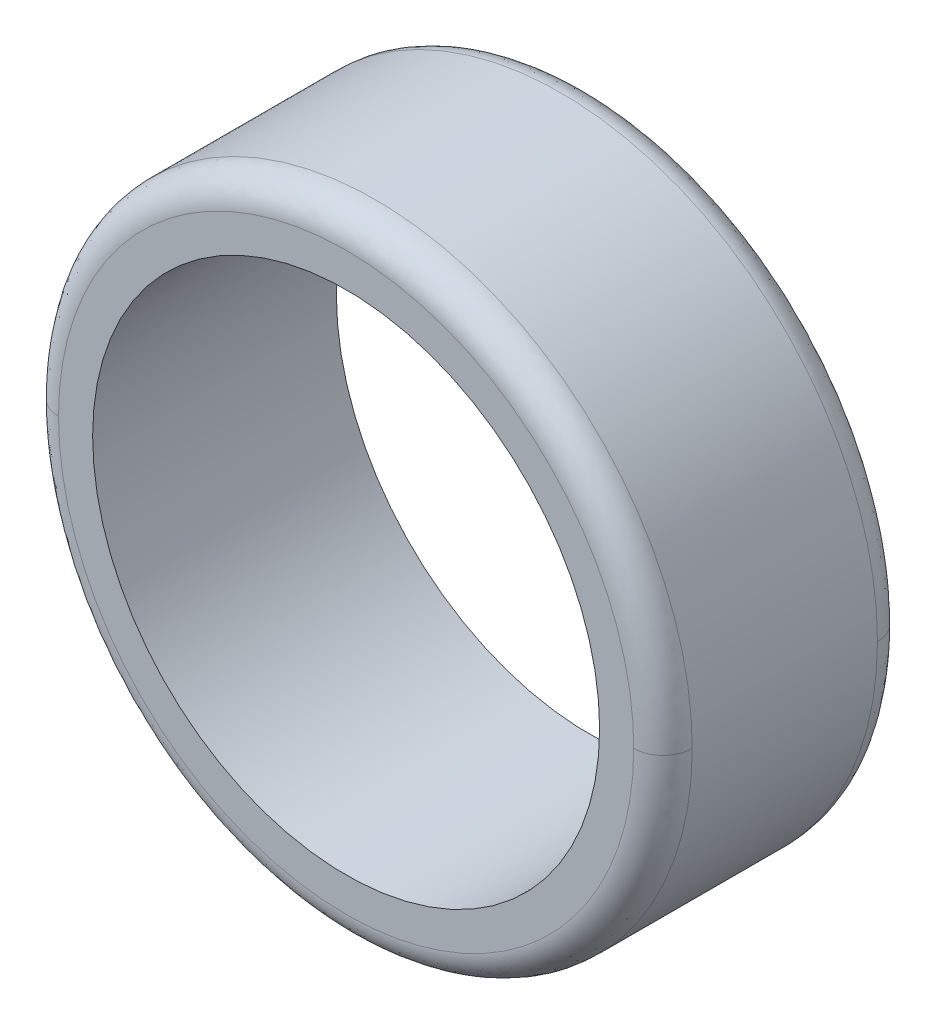
ISO-10303-21;
HEADER;
FILE_DESCRIPTION(('STEP AP214'),'2;1');
FILE_NAME('part.step','',(''),(''),'','','');
FILE_SCHEMA(('AUTOMOTIVE_DESIGN { 1 0 10303 214 1 1 1 1 }'));
ENDSEC;
DATA;
#1=APPLICATION_CONTEXT('core data for automotive mechanical design processes');
#2=APPLICATION_PROTOCOL_DEFINITION('international standard','automotive_design',2000,#1);
#3=PRODUCT_CONTEXT('',#1,'mechanical');
#4=PRODUCT('Part','Part','',(#3));
#5=PRODUCT_RELATED_PRODUCT_CATEGORY('part','',(#4));
#6=PRODUCT_DEFINITION_FORMATION('','',#4);
#7=PRODUCT_DEFINITION_CONTEXT('part definition',#1,'design');
#8=PRODUCT_DEFINITION('design','',#6,#7);
#9=PRODUCT_DEFINITION_SHAPE('','',#8);
#10=(LENGTH_UNIT() NAMED_UNIT(*) SI_UNIT(.MILLI.,.METRE.));
#11=(NAMED_UNIT(*) PLANE_ANGLE_UNIT() SI_UNIT($,.RADIAN.));
#12=(NAMED_UNIT(*) SI_UNIT($,.STERADIAN.) SOLID_ANGLE_UNIT());
#13=UNCERTAINTY_MEASURE_WITH_UNIT(LENGTH_MEASURE(1.E-05),#10,'distance_accuracy_value','');
#14=(GEOMETRIC_REPRESENTATION_CONTEXT(3) GLOBAL_UNCERTAINTY_ASSIGNED_CONTEXT((#13)) GLOBAL_UNIT_ASSIGNED_CONTEXT((#10,
#11,#12)) REPRESENTATION_CONTEXT('',''));
#15=CARTESIAN_POINT('',(0.,0.,0.));
#16=DIRECTION('',(0.,0.,1.));
#17=DIRECTION('',(1.,0.,0.));
#18=AXIS2_PLACEMENT_3D('',#15,#16,#17);
#19=CARTESIAN_POINT('',(-29.854,-29.854,-12.5));
#20=DIRECTION('',(0.,0.,1.));
#21=DIRECTION('',(1.,0.,0.));
#22=AXIS2_PLACEMENT_3D('',#19,#20,#21);
#23=PLANE('',#22);
#24=CARTESIAN_POINT('',(0.,0.,-12.5));
#25=DIRECTION('',(0.,0.,-1.));
#26=DIRECTION('',(-1.,0.,0.));
#27=AXIS2_PLACEMENT_3D('',#24,#25,#26);
#28=CIRCLE('',#27,26.);
#29=CARTESIAN_POINT('',(-26.,0.,-12.5));
#30=VERTEX_POINT('',#29);
#31=EDGE_CURVE('E21',#30,#30,#28,.T.);
#32=ORIENTED_EDGE('',*,*,#31,.F.);
#33=EDGE_LOOP('',(#32));
#34=FACE_BOUND('',#33,.T.);
#35=CARTESIAN_POINT('',(29.500000001415,0.,-12.5000000001223));
#36=CARTESIAN_POINT('',(29.500000001415,59.0000000026987,-12.5000000001223));
#37=CARTESIAN_POINT('',(-29.500000001415,59.0000000026987,-12.5000000001223));
#38=CARTESIAN_POINT('',(-29.500000001415,0.,-12.5000000001223));
#39=(BOUNDED_CURVE() B_SPLINE_CURVE(3,(#35,#36,#37,#38),.UNSPECIFIED.,.F.,
.F.) B_SPLINE_CURVE_WITH_KNOTS((4,4),(0.,1.),
.UNSPECIFIED.) CURVE() GEOMETRIC_REPRESENTATION_ITEM() RATIONAL_B_SPLINE_CURVE((0.956578302161616,
0.318859434053872,0.318859434053872,0.956578302161616)) REPRESENTATION_ITEM(''));
#40=CARTESIAN_POINT('',(29.4999999949896,0.,-12.5000000000734));
#41=VERTEX_POINT('',#40);
#42=CARTESIAN_POINT('',(-29.4999999949896,0.,-12.5000000000734));
#43=VERTEX_POINT('',#42);
#44=EDGE_CURVE('E56',#41,#43,#39,.T.);
#45=ORIENTED_EDGE('',*,*,#44,.F.);
#46=CARTESIAN_POINT('',(-29.500000001415,0.,-12.5000000001223));
#47=CARTESIAN_POINT('',(-29.500000001415,-59.0000000026987,-12.5000000001223));
#48=CARTESIAN_POINT('',(29.500000001415,-59.0000000026987,-12.5000000001223));
#49=CARTESIAN_POINT('',(29.500000001415,0.,-12.5000000001223));
#50=(BOUNDED_CURVE() B_SPLINE_CURVE(3,(#46,#47,#48,#49),.UNSPECIFIED.,.F.,
.F.) B_SPLINE_CURVE_WITH_KNOTS((4,4),(0.,1.),
.UNSPECIFIED.) CURVE() GEOMETRIC_REPRESENTATION_ITEM() RATIONAL_B_SPLINE_CURVE((0.956578302161616,
0.318859434053872,0.318859434053872,0.956578302161616)) REPRESENTATION_ITEM(''));
#51=EDGE_CURVE('E59',#43,#41,#50,.T.);
#52=ORIENTED_EDGE('',*,*,#51,.F.);
#53=EDGE_LOOP('',(#45,#52));
#54=FACE_BOUND('',#53,.T.);
#55=ADVANCED_FACE('F16',(#34,#54),#23,.F.);
#56=CARTESIAN_POINT('',(-32.485012496,0.,-9.20049975));
#57=CARTESIAN_POINT('',(-32.485012496,-64.970024992,-9.20049975));
#58=CARTESIAN_POINT('',(32.485012496,-64.970024992,-9.20049975));
#59=CARTESIAN_POINT('',(32.485012496,0.,-9.20049975));
#60=CARTESIAN_POINT('',(-32.689661268,0.,-11.240161296));
#61=CARTESIAN_POINT('',(-32.689661268,-65.379322536,-11.240161296));
#62=CARTESIAN_POINT('',(32.689661268,-65.379322536,-11.240161296));
#63=CARTESIAN_POINT('',(32.689661268,0.,-11.240161296));
#64=CARTESIAN_POINT('',(-31.240161296,0.,-12.689661268));
#65=CARTESIAN_POINT('',(-31.240161296,-62.480322591,-12.689661268));
#66=CARTESIAN_POINT('',(31.240161296,-62.480322591,-12.689661268));
#67=CARTESIAN_POINT('',(31.240161296,0.,-12.689661268));
#68=CARTESIAN_POINT('',(-29.20049975,0.,-12.485012496));
#69=CARTESIAN_POINT('',(-29.20049975,-58.4009995,-12.485012496));
#70=CARTESIAN_POINT('',(29.20049975,-58.4009995,-12.485012496));
#71=CARTESIAN_POINT('',(29.20049975,0.,-12.485012496));
#72=(BOUNDED_SURFACE() B_SPLINE_SURFACE(3,3,((#56,#57,#58,#59),(#60,#61,#62,#63),(#64,#65,#66,
#67),(#68,#69,#70,#71)),.UNSPECIFIED.,.F.,.F.,.F.) B_SPLINE_SURFACE_WITH_KNOTS((4,4),(4,4),(0.,
1.),(0.,1.),.UNSPECIFIED.) GEOMETRIC_REPRESENTATION_ITEM() RATIONAL_B_SPLINE_SURFACE(((1.,
0.333333333333333,0.333333333333333,1.),(0.755320871117972,0.251773623705991,0.251773623705991,
0.755320871117972),(0.755320871117972,0.251773623705991,0.251773623705991,0.755320871117972),
(1.,0.333333333333333,0.333333333333333,1.))) REPRESENTATION_ITEM('') SURFACE());
#73=CARTESIAN_POINT('',(32.485012496,0.,-9.20049975));
#74=CARTESIAN_POINT('',(32.689661268,0.,-11.240161296));
#75=CARTESIAN_POINT('',(31.240161296,0.,-12.689661268));
#76=CARTESIAN_POINT('',(29.20049975,0.,-12.485012496));
#77=(BOUNDED_CURVE() B_SPLINE_CURVE(3,(#73,#74,#75,#76),.UNSPECIFIED.,.F.,
.F.) B_SPLINE_CURVE_WITH_KNOTS((4,4),(0.,1.),
.UNSPECIFIED.) CURVE() GEOMETRIC_REPRESENTATION_ITEM() RATIONAL_B_SPLINE_CURVE((1.,
0.755320871117972,0.755320871117972,1.)) REPRESENTATION_ITEM(''));
#78=CARTESIAN_POINT('',(32.5000000000306,-9.99879214012239E-09,-9.50000000034546));
#79=VERTEX_POINT('',#78);
#80=EDGE_CURVE('E75',#79,#41,#77,.T.);
#81=CARTESIAN_POINT('',(0.,0.,-9.5));
#82=DIRECTION('',(0.,0.,-1.));
#83=DIRECTION('',(-1.,0.,0.));
#84=AXIS2_PLACEMENT_3D('',#81,#82,#83);
#85=CIRCLE('',#84,32.5);
#86=CARTESIAN_POINT('',(-32.5000000000306,-1.45914646196691E-09,-9.5));
#87=VERTEX_POINT('',#86);
#88=EDGE_CURVE('E71',#79,#87,#85,.T.);
#89=CARTESIAN_POINT('',(-32.485012496,0.,-9.20049975));
#90=CARTESIAN_POINT('',(-32.689661268,0.,-11.240161296));
#91=CARTESIAN_POINT('',(-31.240161296,0.,-12.689661268));
#92=CARTESIAN_POINT('',(-29.20049975,0.,-12.485012496));
#93=(BOUNDED_CURVE() B_SPLINE_CURVE(3,(#89,#90,#91,#92),.UNSPECIFIED.,.F.,
.F.) B_SPLINE_CURVE_WITH_KNOTS((4,4),(0.,1.),
.UNSPECIFIED.) CURVE() GEOMETRIC_REPRESENTATION_ITEM() RATIONAL_B_SPLINE_CURVE((1.,
0.755320871117972,0.755320871117972,1.)) REPRESENTATION_ITEM(''));
#94=EDGE_CURVE('E68',#43,#87,#93,.F.);
#95=ORIENTED_EDGE('',*,*,#80,.F.);
#96=ORIENTED_EDGE('',*,*,#88,.T.);
#97=ORIENTED_EDGE('',*,*,#94,.F.);
#98=ORIENTED_EDGE('',*,*,#51,.T.);
#99=EDGE_LOOP('',(#95,#96,#97,#98));
#100=FACE_BOUND('',#99,.T.);
#101=ADVANCED_FACE('F69',(#100),#72,.T.);
#102=CARTESIAN_POINT('',(32.485012496,0.,-9.20049975));
#103=CARTESIAN_POINT('',(32.485012496,64.970024992,-9.20049975));
#104=CARTESIAN_POINT('',(-32.485012496,64.970024992,-9.20049975));
#105=CARTESIAN_POINT('',(-32.485012496,0.,-9.20049975));
#106=CARTESIAN_POINT('',(32.689661268,0.,-11.240161296));
#107=CARTESIAN_POINT('',(32.689661268,65.379322536,-11.240161296));
#108=CARTESIAN_POINT('',(-32.689661268,65.379322536,-11.240161296));
#109=CARTESIAN_POINT('',(-32.689661268,0.,-11.240161296));
#110=CARTESIAN_POINT('',(31.240161296,0.,-12.689661268));
#111=CARTESIAN_POINT('',(31.240161296,62.480322591,-12.689661268));
#112=CARTESIAN_POINT('',(-31.240161296,62.480322591,-12.689661268));
#113=CARTESIAN_POINT('',(-31.240161296,0.,-12.689661268));
#114=CARTESIAN_POINT('',(29.20049975,0.,-12.485012496));
#115=CARTESIAN_POINT('',(29.20049975,58.4009995,-12.485012496));
#116=CARTESIAN_POINT('',(-29.20049975,58.4009995,-12.485012496));
#117=CARTESIAN_POINT('',(-29.20049975,0.,-12.485012496));
#118=(BOUNDED_SURFACE() B_SPLINE_SURFACE(3,3,((#102,#103,#104,#105),(#106,#107,#108,#109),(#110,
#111,#112,#113),(#114,#115,#116,#117)),.UNSPECIFIED.,.F.,.F.,
.F.) B_SPLINE_SURFACE_WITH_KNOTS((4,4),(4,4),(0.,1.),(0.,1.),
.UNSPECIFIED.) GEOMETRIC_REPRESENTATION_ITEM() RATIONAL_B_SPLINE_SURFACE(((1.,0.333333333333333,
0.333333333333333,1.),(0.755320871117972,0.251773623705991,0.251773623705991,0.755320871117972),
(0.755320871117972,0.251773623705991,0.251773623705991,0.755320871117972),(1.,0.333333333333333,
0.333333333333333,1.))) REPRESENTATION_ITEM('') SURFACE());
#119=CARTESIAN_POINT('',(0.,0.,-9.5));
#120=DIRECTION('',(0.,0.,-1.));
#121=DIRECTION('',(-1.,0.,0.));
#122=AXIS2_PLACEMENT_3D('',#119,#120,#121);
#123=CIRCLE('',#122,32.5);
#124=EDGE_CURVE('E162',#87,#79,#123,.T.);
#125=ORIENTED_EDGE('',*,*,#124,.T.);
#126=ORIENTED_EDGE('',*,*,#80,.T.);
#127=ORIENTED_EDGE('',*,*,#44,.T.);
#128=ORIENTED_EDGE('',*,*,#94,.T.);
#129=EDGE_LOOP('',(#125,#126,#127,#128));
#130=FACE_BOUND('',#129,.T.);
#131=ADVANCED_FACE('F78',(#130),#118,.T.);
#132=CARTESIAN_POINT('',(0.,0.,12.5));
#133=DIRECTION('',(0.,0.,-1.));
#134=DIRECTION('',(-1.,0.,0.));
#135=AXIS2_PLACEMENT_3D('',#132,#133,#134);
#136=CYLINDRICAL_SURFACE('',#135,26.);
#137=CARTESIAN_POINT('',(0.,0.,12.5));
#138=DIRECTION('',(0.,0.,-1.));
#139=DIRECTION('',(-1.,0.,0.));
#140=AXIS2_PLACEMENT_3D('',#137,#138,#139);
#141=CIRCLE('',#140,26.);
#142=CARTESIAN_POINT('',(-26.,0.,12.5));
#143=VERTEX_POINT('',#142);
#144=EDGE_CURVE('E154',#143,#143,#141,.T.);
#145=ORIENTED_EDGE('',*,*,#144,.F.);
#146=EDGE_LOOP('',(#145));
#147=FACE_BOUND('',#146,.T.);
#148=ORIENTED_EDGE('',*,*,#31,.T.);
#149=EDGE_LOOP('',(#148));
#150=FACE_BOUND('',#149,.T.);
#151=ADVANCED_FACE('F99',(#147,#150),#136,.F.);
#152=CARTESIAN_POINT('',(0.,0.,9.5));
#153=DIRECTION('',(0.,0.,-1.));
#154=DIRECTION('',(-1.,0.,0.));
#155=AXIS2_PLACEMENT_3D('',#152,#153,#154);
#156=CYLINDRICAL_SURFACE('',#155,32.5);
#157=ORIENTED_EDGE('',*,*,#124,.F.);
#158=ORIENTED_EDGE('',*,*,#88,.F.);
#159=EDGE_LOOP('',(#157,#158));
#160=FACE_BOUND('',#159,.T.);
#161=CARTESIAN_POINT('',(0.,0.,9.50000000138184));
#162=DIRECTION('',(0.,0.,1.));
#163=DIRECTION('',(1.,0.,0.));
#164=AXIS2_PLACEMENT_3D('',#161,#162,#163);
#165=CIRCLE('',#164,32.5000000001223);
#166=CARTESIAN_POINT('',(32.5000000000917,-3.33293071337413E-09,9.50000000138184));
#167=VERTEX_POINT('',#166);
#168=CARTESIAN_POINT('',(-32.5000000000917,0.,9.50000000103638));
#169=VERTEX_POINT('',#168);
#170=EDGE_CURVE('E225',#167,#169,#165,.T.);
#171=ORIENTED_EDGE('',*,*,#170,.F.);
#172=CARTESIAN_POINT('',(0.,0.,9.50000000138184));
#173=DIRECTION('',(0.,0.,1.));
#174=DIRECTION('',(1.,0.,0.));
#175=AXIS2_PLACEMENT_3D('',#172,#173,#174);
#176=CIRCLE('',#175,32.5000000001223);
#177=EDGE_CURVE('E161',#169,#167,#176,.T.);
#178=ORIENTED_EDGE('',*,*,#177,.F.);
#179=EDGE_LOOP('',(#171,#178));
#180=FACE_BOUND('',#179,.T.);
#181=ADVANCED_FACE('F185',(#160,#180),#156,.T.);
#182=CARTESIAN_POINT('',(-29.854,-29.854,12.5));
#183=DIRECTION('',(0.,0.,1.));
#184=DIRECTION('',(1.,0.,0.));
#185=AXIS2_PLACEMENT_3D('',#182,#183,#184);
#186=PLANE('',#185);
#187=ORIENTED_EDGE('',*,*,#144,.T.);
#188=EDGE_LOOP('',(#187));
#189=FACE_BOUND('',#188,.T.);
#190=CARTESIAN_POINT('',(-29.500000001415,0.,12.5000000001223));
#191=CARTESIAN_POINT('',(-29.500000001415,59.0000000026987,12.5000000001223));
#192=CARTESIAN_POINT('',(29.500000001415,59.0000000026987,12.5000000001223));
#193=CARTESIAN_POINT('',(29.500000001415,0.,12.5000000001223));
#194=(BOUNDED_CURVE() B_SPLINE_CURVE(3,(#190,#191,#192,#193),.UNSPECIFIED.,.F.,
.F.) B_SPLINE_CURVE_WITH_KNOTS((4,4),(0.,1.),
.UNSPECIFIED.) CURVE() GEOMETRIC_REPRESENTATION_ITEM() RATIONAL_B_SPLINE_CURVE((0.956578302161616,
0.318859434053872,0.318859434053872,0.956578302161616)) REPRESENTATION_ITEM(''));
#195=CARTESIAN_POINT('',(-29.4999999949896,0.,12.5000000000734));
#196=VERTEX_POINT('',#195);
#197=CARTESIAN_POINT('',(29.4999999949896,0.,12.5000000000734));
#198=VERTEX_POINT('',#197);
#199=EDGE_CURVE('E27',#196,#198,#194,.T.);
#200=ORIENTED_EDGE('',*,*,#199,.F.);
#201=CARTESIAN_POINT('',(29.500000001415,0.,12.5000000001223));
#202=CARTESIAN_POINT('',(29.500000001415,-59.0000000026987,12.5000000001223));
#203=CARTESIAN_POINT('',(-29.500000001415,-59.0000000026987,12.5000000001223));
#204=CARTESIAN_POINT('',(-29.500000001415,0.,12.5000000001223));
#205=(BOUNDED_CURVE() B_SPLINE_CURVE(3,(#201,#202,#203,#204),.UNSPECIFIED.,.F.,
.F.) B_SPLINE_CURVE_WITH_KNOTS((4,4),(0.,1.),
.UNSPECIFIED.) CURVE() GEOMETRIC_REPRESENTATION_ITEM() RATIONAL_B_SPLINE_CURVE((0.956578302161617,
0.318859434053872,0.318859434053872,0.956578302161617)) REPRESENTATION_ITEM(''));
#206=EDGE_CURVE('E35',#198,#196,#205,.T.);
#207=ORIENTED_EDGE('',*,*,#206,.F.);
#208=EDGE_LOOP('',(#200,#207));
#209=FACE_BOUND('',#208,.T.);
#210=ADVANCED_FACE('F18',(#189,#209),#186,.T.);
#211=CARTESIAN_POINT('',(-29.20049975,0.,12.485012496));
#212=CARTESIAN_POINT('',(-29.20049975,-58.4009995,12.485012496));
#213=CARTESIAN_POINT('',(29.20049975,-58.4009995,12.485012496));
#214=CARTESIAN_POINT('',(29.20049975,0.,12.485012496));
#215=CARTESIAN_POINT('',(-31.240161296,0.,12.689661268));
#216=CARTESIAN_POINT('',(-31.240161296,-62.480322591,12.689661268));
#217=CARTESIAN_POINT('',(31.240161296,-62.480322591,12.689661268));
#218=CARTESIAN_POINT('',(31.240161296,0.,12.689661268));
#219=CARTESIAN_POINT('',(-32.689661268,0.,11.240161296));
#220=CARTESIAN_POINT('',(-32.689661268,-65.379322536,11.240161296));
#221=CARTESIAN_POINT('',(32.689661268,-65.379322536,11.240161296));
#222=CARTESIAN_POINT('',(32.689661268,0.,11.240161296));
#223=CARTESIAN_POINT('',(-32.485012496,0.,9.20049975));
#224=CARTESIAN_POINT('',(-32.485012496,-64.970024992,9.20049975));
#225=CARTESIAN_POINT('',(32.485012496,-64.970024992,9.20049975));
#226=CARTESIAN_POINT('',(32.485012496,0.,9.20049975));
#227=(BOUNDED_SURFACE() B_SPLINE_SURFACE(3,3,((#211,#212,#213,#214),(#215,#216,#217,#218),(#219,
#220,#221,#222),(#223,#224,#225,#226)),.UNSPECIFIED.,.F.,.F.,
.F.) B_SPLINE_SURFACE_WITH_KNOTS((4,4),(4,4),(0.,1.),(0.,1.),
.UNSPECIFIED.) GEOMETRIC_REPRESENTATION_ITEM() RATIONAL_B_SPLINE_SURFACE(((1.,0.333333333333333,
0.333333333333333,1.),(0.755320871117972,0.251773623705991,0.251773623705991,0.755320871117972),
(0.755320871117972,0.251773623705991,0.251773623705991,0.755320871117972),(1.,0.333333333333333,
0.333333333333333,1.))) REPRESENTATION_ITEM('') SURFACE());
#228=CARTESIAN_POINT('',(29.20049975,0.,12.485012496));
#229=CARTESIAN_POINT('',(31.240161296,0.,12.689661268));
#230=CARTESIAN_POINT('',(32.689661268,0.,11.240161296));
#231=CARTESIAN_POINT('',(32.485012496,0.,9.20049975));
#232=(BOUNDED_CURVE() B_SPLINE_CURVE(3,(#228,#229,#230,#231),.UNSPECIFIED.,.F.,
.F.) B_SPLINE_CURVE_WITH_KNOTS((4,4),(0.,1.),
.UNSPECIFIED.) CURVE() GEOMETRIC_REPRESENTATION_ITEM() RATIONAL_B_SPLINE_CURVE((1.,
0.755320871117972,0.755320871117972,1.)) REPRESENTATION_ITEM(''));
#233=EDGE_CURVE('E11',#198,#167,#232,.T.);
#234=CARTESIAN_POINT('',(-29.20049975,0.,12.485012496));
#235=CARTESIAN_POINT('',(-31.240161296,0.,12.689661268));
#236=CARTESIAN_POINT('',(-32.689661268,0.,11.240161296));
#237=CARTESIAN_POINT('',(-32.485012496,0.,9.20049975));
#238=(BOUNDED_CURVE() B_SPLINE_CURVE(3,(#234,#235,#236,#237),.UNSPECIFIED.,.F.,
.F.) B_SPLINE_CURVE_WITH_KNOTS((4,4),(0.,1.),
.UNSPECIFIED.) CURVE() GEOMETRIC_REPRESENTATION_ITEM() RATIONAL_B_SPLINE_CURVE((1.,
0.755320871117972,0.755320871117972,1.)) REPRESENTATION_ITEM(''));
#239=EDGE_CURVE('E218',#169,#196,#238,.F.);
#240=ORIENTED_EDGE('',*,*,#233,.F.);
#241=ORIENTED_EDGE('',*,*,#206,.T.);
#242=ORIENTED_EDGE('',*,*,#239,.F.);
#243=ORIENTED_EDGE('',*,*,#177,.T.);
#244=EDGE_LOOP('',(#240,#241,#242,#243));
#245=FACE_BOUND('',#244,.T.);
#246=ADVANCED_FACE('F194',(#245),#227,.T.);
#247=CARTESIAN_POINT('',(29.20049975,0.,12.485012496));
#248=CARTESIAN_POINT('',(29.20049975,58.4009995,12.485012496));
#249=CARTESIAN_POINT('',(-29.20049975,58.4009995,12.485012496));
#250=CARTESIAN_POINT('',(-29.20049975,0.,12.485012496));
#251=CARTESIAN_POINT('',(31.240161296,0.,12.689661268));
#252=CARTESIAN_POINT('',(31.240161296,62.480322591,12.689661268));
#253=CARTESIAN_POINT('',(-31.240161296,62.480322591,12.689661268));
#254=CARTESIAN_POINT('',(-31.240161296,0.,12.689661268));
#255=CARTESIAN_POINT('',(32.689661268,0.,11.240161296));
#256=CARTESIAN_POINT('',(32.689661268,65.379322536,11.240161296));
#257=CARTESIAN_POINT('',(-32.689661268,65.379322536,11.240161296));
#258=CARTESIAN_POINT('',(-32.689661268,0.,11.240161296));
#259=CARTESIAN_POINT('',(32.485012496,0.,9.20049975));
#260=CARTESIAN_POINT('',(32.485012496,64.970024992,9.20049975));
#261=CARTESIAN_POINT('',(-32.485012496,64.970024992,9.20049975));
#262=CARTESIAN_POINT('',(-32.485012496,0.,9.20049975));
#263=(BOUNDED_SURFACE() B_SPLINE_SURFACE(3,3,((#247,#248,#249,#250),(#251,#252,#253,#254),(#255,
#256,#257,#258),(#259,#260,#261,#262)),.UNSPECIFIED.,.F.,.F.,
.F.) B_SPLINE_SURFACE_WITH_KNOTS((4,4),(4,4),(0.,1.),(0.,1.),
.UNSPECIFIED.) GEOMETRIC_REPRESENTATION_ITEM() RATIONAL_B_SPLINE_SURFACE(((1.,0.333333333333333,
0.333333333333333,1.),(0.755320871117972,0.251773623705991,0.251773623705991,0.755320871117972),
(0.755320871117972,0.251773623705991,0.251773623705991,0.755320871117972),(1.,0.333333333333333,
0.333333333333333,1.))) REPRESENTATION_ITEM('') SURFACE());
#264=ORIENTED_EDGE('',*,*,#199,.T.);
#265=ORIENTED_EDGE('',*,*,#233,.T.);
#266=ORIENTED_EDGE('',*,*,#170,.T.);
#267=ORIENTED_EDGE('',*,*,#239,.T.);
#268=EDGE_LOOP('',(#264,#265,#266,#267));
#269=FACE_BOUND('',#268,.T.);
#270=ADVANCED_FACE('F192',(#269),#263,.T.);
#271=CLOSED_SHELL('',(#55,#101,#131,#151,#181,#210,#246,#270));
#272=MANIFOLD_SOLID_BREP('B1',#271);
#273=ADVANCED_BREP_SHAPE_REPRESENTATION('',(#18,#272),#14);
#274=SHAPE_DEFINITION_REPRESENTATION(#9,#273);
ENDSEC;
END-ISO-10303-21;
